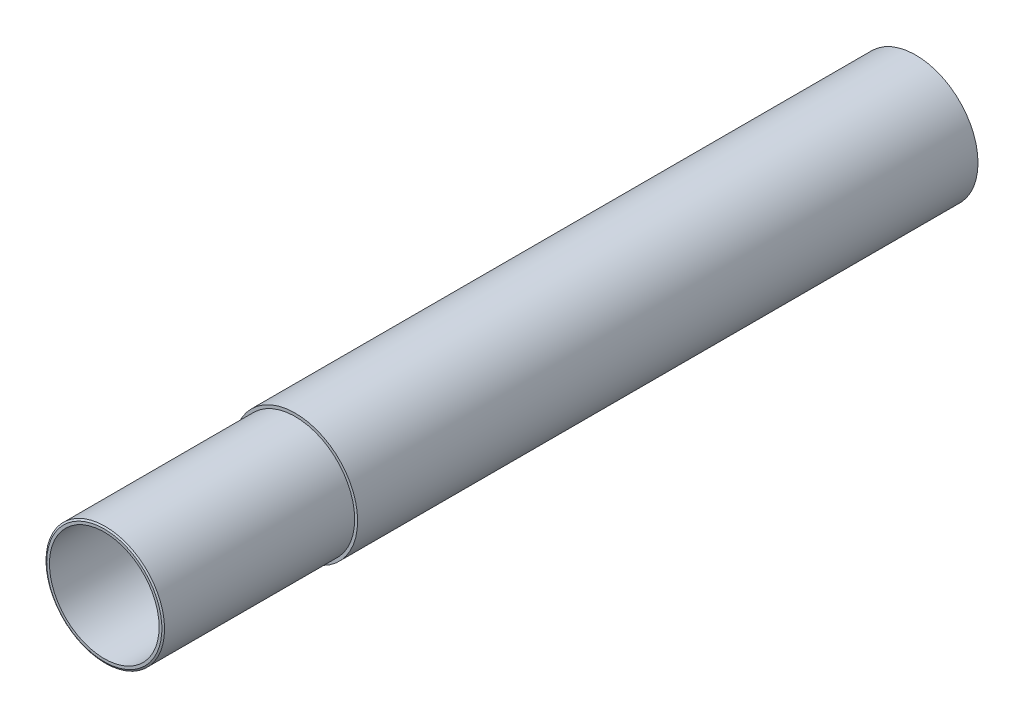
ISO-10303-21;
HEADER;
FILE_DESCRIPTION(('STEP AP214'),'2;1');
FILE_NAME('part.step','',(''),(''),'','','');
FILE_SCHEMA(('AUTOMOTIVE_DESIGN { 1 0 10303 214 1 1 1 1 }'));
ENDSEC;
DATA;
#1=APPLICATION_CONTEXT('core data for automotive mechanical design processes');
#2=APPLICATION_PROTOCOL_DEFINITION('international standard','automotive_design',2000,#1);
#3=PRODUCT_CONTEXT('',#1,'mechanical');
#4=PRODUCT('Part','Part','',(#3));
#5=PRODUCT_RELATED_PRODUCT_CATEGORY('part','',(#4));
#6=PRODUCT_DEFINITION_FORMATION('','',#4);
#7=PRODUCT_DEFINITION_CONTEXT('part definition',#1,'design');
#8=PRODUCT_DEFINITION('design','',#6,#7);
#9=PRODUCT_DEFINITION_SHAPE('','',#8);
#10=(LENGTH_UNIT() NAMED_UNIT(*) SI_UNIT(.MILLI.,.METRE.));
#11=(NAMED_UNIT(*) PLANE_ANGLE_UNIT() SI_UNIT($,.RADIAN.));
#12=(NAMED_UNIT(*) SI_UNIT($,.STERADIAN.) SOLID_ANGLE_UNIT());
#13=UNCERTAINTY_MEASURE_WITH_UNIT(LENGTH_MEASURE(1.E-05),#10,'distance_accuracy_value','');
#14=(GEOMETRIC_REPRESENTATION_CONTEXT(3) GLOBAL_UNCERTAINTY_ASSIGNED_CONTEXT((#13)) GLOBAL_UNIT_ASSIGNED_CONTEXT((#10,
#11,#12)) REPRESENTATION_CONTEXT('',''));
#15=CARTESIAN_POINT('',(0.,0.,0.));
#16=DIRECTION('',(0.,0.,1.));
#17=DIRECTION('',(1.,0.,0.));
#18=AXIS2_PLACEMENT_3D('',#15,#16,#17);
#19=CARTESIAN_POINT('',(0.,0.,217.325));
#20=DIRECTION('',(0.,0.,-1.));
#21=DIRECTION('',(-1.,0.,0.));
#22=AXIS2_PLACEMENT_3D('',#19,#20,#21);
#23=CYLINDRICAL_SURFACE('',#22,33.3375);
#24=CARTESIAN_POINT('',(0.,0.,-217.325));
#25=DIRECTION('',(0.,0.,1.));
#26=DIRECTION('',(1.,0.,0.));
#27=AXIS2_PLACEMENT_3D('',#24,#25,#26);
#28=CIRCLE('',#27,33.3375);
#29=CARTESIAN_POINT('',(33.3375,0.,-217.325));
#30=VERTEX_POINT('',#29);
#31=EDGE_CURVE('E11',#30,#30,#28,.T.);
#32=ORIENTED_EDGE('',*,*,#31,.T.);
#33=EDGE_LOOP('',(#32));
#34=FACE_BOUND('',#33,.T.);
#35=CARTESIAN_POINT('',(0.,0.,114.975));
#36=DIRECTION('',(0.,0.,1.));
#37=DIRECTION('',(1.,0.,0.));
#38=AXIS2_PLACEMENT_3D('',#35,#36,#37);
#39=CIRCLE('',#38,33.3375);
#40=CARTESIAN_POINT('',(33.3375,0.,114.975));
#41=VERTEX_POINT('',#40);
#42=EDGE_CURVE('E58',#41,#41,#39,.T.);
#43=ORIENTED_EDGE('',*,*,#42,.F.);
#44=EDGE_LOOP('',(#43));
#45=FACE_BOUND('',#44,.T.);
#46=ADVANCED_FACE('F39',(#34,#45),#23,.T.);
#47=CARTESIAN_POINT('',(0.,0.,217.325));
#48=DIRECTION('',(0.,0.,-1.));
#49=DIRECTION('',(-1.,0.,0.));
#50=AXIS2_PLACEMENT_3D('',#47,#48,#49);
#51=CONICAL_SURFACE('',#50,30.8375,1.04719755119661);
#52=CARTESIAN_POINT('',(0.,0.,217.325));
#53=DIRECTION('',(0.,0.,-1.));
#54=DIRECTION('',(-1.,0.,0.));
#55=AXIS2_PLACEMENT_3D('',#52,#53,#54);
#56=CIRCLE('',#55,30.8375);
#57=CARTESIAN_POINT('',(-30.8375,0.,217.325));
#58=VERTEX_POINT('',#57);
#59=EDGE_CURVE('E54',#58,#58,#56,.T.);
#60=ORIENTED_EDGE('',*,*,#59,.T.);
#61=EDGE_LOOP('',(#60));
#62=FACE_BOUND('',#61,.T.);
#63=CARTESIAN_POINT('',(0.,0.,216.798167879364));
#64=DIRECTION('',(0.,0.,-1.));
#65=DIRECTION('',(-1.,0.,0.));
#66=AXIS2_PLACEMENT_3D('',#63,#64,#65);
#67=CIRCLE('',#66,31.75);
#68=CARTESIAN_POINT('',(-31.75,0.,216.798167879364));
#69=VERTEX_POINT('',#68);
#70=EDGE_CURVE('E42',#69,#69,#67,.T.);
#71=ORIENTED_EDGE('',*,*,#70,.F.);
#72=EDGE_LOOP('',(#71));
#73=FACE_BOUND('',#72,.T.);
#74=ADVANCED_FACE('F75',(#62,#73),#51,.T.);
#75=CARTESIAN_POINT('',(0.,0.,217.325));
#76=DIRECTION('',(0.,0.,1.));
#77=DIRECTION('',(1.,0.,0.));
#78=AXIS2_PLACEMENT_3D('',#75,#76,#77);
#79=PLANE('',#78);
#80=CARTESIAN_POINT('',(0.,0.,217.325));
#81=DIRECTION('',(0.,0.,1.));
#82=DIRECTION('',(1.,0.,0.));
#83=AXIS2_PLACEMENT_3D('',#80,#81,#82);
#84=CIRCLE('',#83,29.3751);
#85=CARTESIAN_POINT('',(29.3751,0.,217.325));
#86=VERTEX_POINT('',#85);
#87=EDGE_CURVE('E46',#86,#86,#84,.T.);
#88=ORIENTED_EDGE('',*,*,#87,.F.);
#89=EDGE_LOOP('',(#88));
#90=FACE_BOUND('',#89,.T.);
#91=ORIENTED_EDGE('',*,*,#59,.F.);
#92=EDGE_LOOP('',(#91));
#93=FACE_BOUND('',#92,.T.);
#94=ADVANCED_FACE('F80',(#90,#93),#79,.T.);
#95=CARTESIAN_POINT('',(0.,0.,-217.325));
#96=DIRECTION('',(0.,0.,1.));
#97=DIRECTION('',(1.,0.,0.));
#98=AXIS2_PLACEMENT_3D('',#95,#96,#97);
#99=PLANE('',#98);
#100=ORIENTED_EDGE('',*,*,#31,.F.);
#101=EDGE_LOOP('',(#100));
#102=FACE_BOUND('',#101,.T.);
#103=CARTESIAN_POINT('',(0.,0.,-217.325));
#104=DIRECTION('',(0.,0.,1.));
#105=DIRECTION('',(1.,0.,0.));
#106=AXIS2_PLACEMENT_3D('',#103,#104,#105);
#107=CIRCLE('',#106,29.3751);
#108=CARTESIAN_POINT('',(29.3751,0.,-217.325));
#109=VERTEX_POINT('',#108);
#110=EDGE_CURVE('E50',#109,#109,#107,.T.);
#111=ORIENTED_EDGE('',*,*,#110,.T.);
#112=EDGE_LOOP('',(#111));
#113=FACE_BOUND('',#112,.T.);
#114=ADVANCED_FACE('F86',(#102,#113),#99,.F.);
#115=CARTESIAN_POINT('',(0.,0.,217.325));
#116=DIRECTION('',(0.,0.,-1.));
#117=DIRECTION('',(-1.,0.,0.));
#118=AXIS2_PLACEMENT_3D('',#115,#116,#117);
#119=CYLINDRICAL_SURFACE('',#118,29.3751);
#120=ORIENTED_EDGE('',*,*,#87,.T.);
#121=EDGE_LOOP('',(#120));
#122=FACE_BOUND('',#121,.T.);
#123=ORIENTED_EDGE('',*,*,#110,.F.);
#124=EDGE_LOOP('',(#123));
#125=FACE_BOUND('',#124,.T.);
#126=ADVANCED_FACE('F92',(#122,#125),#119,.F.);
#127=CARTESIAN_POINT('',(0.,0.,114.975));
#128=DIRECTION('',(0.,0.,1.));
#129=DIRECTION('',(1.,0.,0.));
#130=AXIS2_PLACEMENT_3D('',#127,#128,#129);
#131=CYLINDRICAL_SURFACE('',#130,31.75);
#132=CARTESIAN_POINT('',(0.,0.,114.975));
#133=DIRECTION('',(0.,0.,1.));
#134=DIRECTION('',(1.,0.,0.));
#135=AXIS2_PLACEMENT_3D('',#132,#133,#134);
#136=CIRCLE('',#135,31.75);
#137=CARTESIAN_POINT('',(31.75,0.,114.975));
#138=VERTEX_POINT('',#137);
#139=EDGE_CURVE('E61',#138,#138,#136,.T.);
#140=ORIENTED_EDGE('',*,*,#139,.T.);
#141=EDGE_LOOP('',(#140));
#142=FACE_BOUND('',#141,.T.);
#143=ORIENTED_EDGE('',*,*,#70,.T.);
#144=EDGE_LOOP('',(#143));
#145=FACE_BOUND('',#144,.T.);
#146=ADVANCED_FACE('F65',(#142,#145),#131,.T.);
#147=CARTESIAN_POINT('',(0.,0.,114.975));
#148=DIRECTION('',(0.,0.,1.));
#149=DIRECTION('',(1.,0.,0.));
#150=AXIS2_PLACEMENT_3D('',#147,#148,#149);
#151=PLANE('',#150);
#152=ORIENTED_EDGE('',*,*,#139,.F.);
#153=EDGE_LOOP('',(#152));
#154=FACE_BOUND('',#153,.T.);
#155=ORIENTED_EDGE('',*,*,#42,.T.);
#156=EDGE_LOOP('',(#155));
#157=FACE_BOUND('',#156,.T.);
#158=ADVANCED_FACE('F68',(#154,#157),#151,.T.);
#159=CLOSED_SHELL('',(#46,#74,#94,#114,#126,#146,#158));
#160=MANIFOLD_SOLID_BREP('B2',#159);
#161=ADVANCED_BREP_SHAPE_REPRESENTATION('',(#18,#160),#14);
#162=SHAPE_DEFINITION_REPRESENTATION(#9,#161);
ENDSEC;
END-ISO-10303-21;
